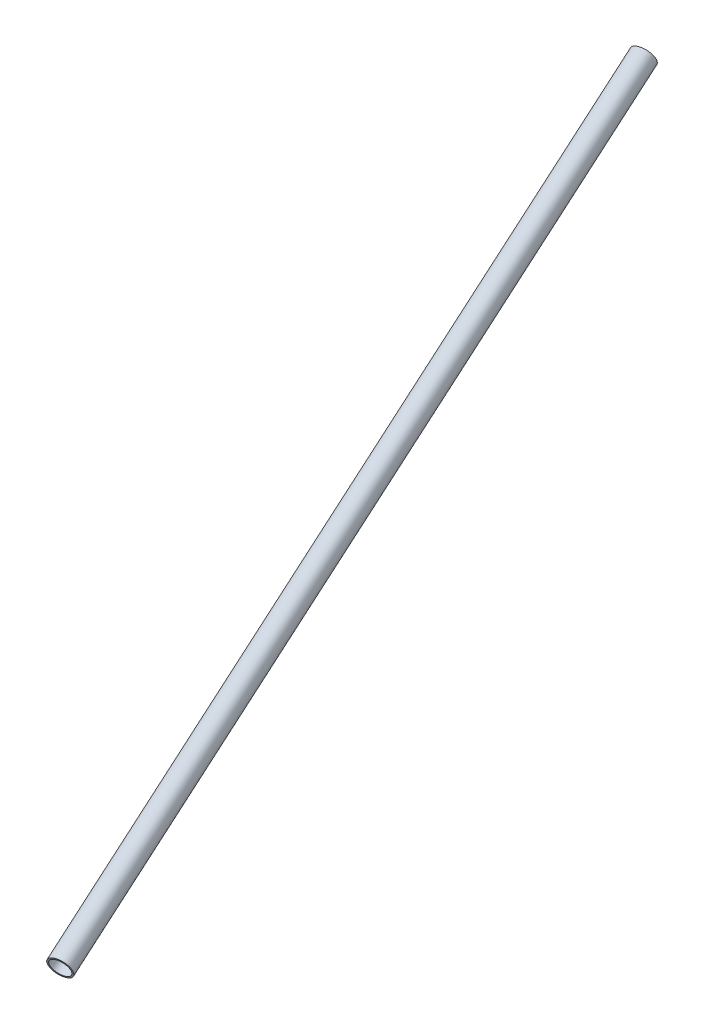
ISO-10303-21;
HEADER;
FILE_DESCRIPTION(('STEP AP214'),'2;1');
FILE_NAME('part.step','',(''),(''),'','','');
FILE_SCHEMA(('AUTOMOTIVE_DESIGN { 1 0 10303 214 1 1 1 1 }'));
ENDSEC;
DATA;
#1=APPLICATION_CONTEXT('core data for automotive mechanical design processes');
#2=APPLICATION_PROTOCOL_DEFINITION('international standard','automotive_design',2000,#1);
#3=PRODUCT_CONTEXT('',#1,'mechanical');
#4=PRODUCT('Part','Part','',(#3));
#5=PRODUCT_RELATED_PRODUCT_CATEGORY('part','',(#4));
#6=PRODUCT_DEFINITION_FORMATION('','',#4);
#7=PRODUCT_DEFINITION_CONTEXT('part definition',#1,'design');
#8=PRODUCT_DEFINITION('design','',#6,#7);
#9=PRODUCT_DEFINITION_SHAPE('','',#8);
#10=(LENGTH_UNIT() NAMED_UNIT(*) SI_UNIT(.MILLI.,.METRE.));
#11=(NAMED_UNIT(*) PLANE_ANGLE_UNIT() SI_UNIT($,.RADIAN.));
#12=(NAMED_UNIT(*) SI_UNIT($,.STERADIAN.) SOLID_ANGLE_UNIT());
#13=UNCERTAINTY_MEASURE_WITH_UNIT(LENGTH_MEASURE(1.E-05),#10,'distance_accuracy_value','');
#14=(GEOMETRIC_REPRESENTATION_CONTEXT(3) GLOBAL_UNCERTAINTY_ASSIGNED_CONTEXT((#13)) GLOBAL_UNIT_ASSIGNED_CONTEXT((#10,
#11,#12)) REPRESENTATION_CONTEXT('',''));
#15=CARTESIAN_POINT('',(0.,0.,0.));
#16=DIRECTION('',(0.,0.,1.));
#17=DIRECTION('',(1.,0.,0.));
#18=AXIS2_PLACEMENT_3D('',#15,#16,#17);
#19=CARTESIAN_POINT('',(-325.,320.,-1580.));
#20=DIRECTION('',(0.208710809439999,-0.381642622975999,0.900438063583998));
#21=DIRECTION('',(0.,-0.920714591276893,-0.390236647958419));
#22=AXIS2_PLACEMENT_3D('',#19,#20,#21);
#23=CYLINDRICAL_SURFACE('',#22,9.39999999999998);
#24=CARTESIAN_POINT('',(-325.,320.,-1580.));
#25=DIRECTION('',(-0.208710809439999,0.381642622975999,-0.900438063583998));
#26=DIRECTION('',(0.626062072534467,-0.655192350751652,-0.422811145608027));
#27=AXIS2_PLACEMENT_3D('',#24,#25,#26);
#28=CIRCLE('',#27,9.39999999999998);
#29=CARTESIAN_POINT('',(-319.115016518176,313.841191902934,-1583.97442476872));
#30=VERTEX_POINT('',#29);
#31=EDGE_CURVE('E46',#30,#30,#28,.T.);
#32=ORIENTED_EDGE('',*,*,#31,.T.);
#33=EDGE_LOOP('',(#32));
#34=FACE_BOUND('',#33,.T.);
#35=CARTESIAN_POINT('',(-150.,-4.44089209850063E-13,-825.));
#36=DIRECTION('',(-0.208710809439999,0.381642622975999,-0.900438063583998));
#37=DIRECTION('',(0.626062072534467,-0.655192350751652,-0.422811145608027));
#38=AXIS2_PLACEMENT_3D('',#35,#36,#37);
#39=CIRCLE('',#38,9.39999999999998);
#40=CARTESIAN_POINT('',(-144.115016518176,-6.15880809706596,-828.974424768715));
#41=VERTEX_POINT('',#40);
#42=EDGE_CURVE('E52',#41,#41,#39,.T.);
#43=ORIENTED_EDGE('',*,*,#42,.F.);
#44=EDGE_LOOP('',(#43));
#45=FACE_BOUND('',#44,.T.);
#46=ADVANCED_FACE('F39',(#34,#45),#23,.F.);
#47=CARTESIAN_POINT('',(-325.,320.,-1580.));
#48=DIRECTION('',(0.208710809439999,-0.381642622975999,0.900438063583998));
#49=DIRECTION('',(0.,-0.920714591276893,-0.390236647958419));
#50=AXIS2_PLACEMENT_3D('',#47,#48,#49);
#51=CYLINDRICAL_SURFACE('',#50,11.);
#52=CARTESIAN_POINT('',(-325.,320.,-1580.));
#53=DIRECTION('',(-0.208710809439999,0.381642622975999,-0.900438063583998));
#54=DIRECTION('',(0.626062072534467,-0.655192350751652,-0.422811145608027));
#55=AXIS2_PLACEMENT_3D('',#52,#53,#54);
#56=CIRCLE('',#55,11.);
#57=CARTESIAN_POINT('',(-318.113317202121,312.792884141731,-1584.65092260169));
#58=VERTEX_POINT('',#57);
#59=EDGE_CURVE('E10',#58,#58,#56,.T.);
#60=ORIENTED_EDGE('',*,*,#59,.F.);
#61=EDGE_LOOP('',(#60));
#62=FACE_BOUND('',#61,.T.);
#63=CARTESIAN_POINT('',(-150.,-4.44089209850063E-13,-825.));
#64=DIRECTION('',(-0.208710809439999,0.381642622975999,-0.900438063583998));
#65=DIRECTION('',(0.626062072534467,-0.655192350751652,-0.422811145608027));
#66=AXIS2_PLACEMENT_3D('',#63,#64,#65);
#67=CIRCLE('',#66,11.);
#68=CARTESIAN_POINT('',(-143.113317202121,-7.20711585826862,-829.650922601688));
#69=VERTEX_POINT('',#68);
#70=EDGE_CURVE('E42',#69,#69,#67,.T.);
#71=ORIENTED_EDGE('',*,*,#70,.T.);
#72=EDGE_LOOP('',(#71));
#73=FACE_BOUND('',#72,.T.);
#74=ADVANCED_FACE('F59',(#62,#73),#51,.T.);
#75=CARTESIAN_POINT('',(-325.,320.,-1580.));
#76=DIRECTION('',(-0.208710809439999,0.381642622975999,-0.900438063583998));
#77=DIRECTION('',(0.626062072534467,-0.655192350751652,-0.422811145608027));
#78=AXIS2_PLACEMENT_3D('',#75,#76,#77);
#79=PLANE('',#78);
#80=ORIENTED_EDGE('',*,*,#31,.F.);
#81=EDGE_LOOP('',(#80));
#82=FACE_BOUND('',#81,.T.);
#83=ORIENTED_EDGE('',*,*,#59,.T.);
#84=EDGE_LOOP('',(#83));
#85=FACE_BOUND('',#84,.T.);
#86=ADVANCED_FACE('F63',(#82,#85),#79,.T.);
#87=CARTESIAN_POINT('',(-150.,-4.44089209850063E-13,-825.));
#88=DIRECTION('',(-0.208710809439999,0.381642622975999,-0.900438063583998));
#89=DIRECTION('',(0.626062072534467,-0.655192350751652,-0.422811145608027));
#90=AXIS2_PLACEMENT_3D('',#87,#88,#89);
#91=PLANE('',#90);
#92=ORIENTED_EDGE('',*,*,#42,.T.);
#93=EDGE_LOOP('',(#92));
#94=FACE_BOUND('',#93,.T.);
#95=ORIENTED_EDGE('',*,*,#70,.F.);
#96=EDGE_LOOP('',(#95));
#97=FACE_BOUND('',#96,.T.);
#98=ADVANCED_FACE('F61',(#94,#97),#91,.F.);
#99=CLOSED_SHELL('',(#46,#74,#86,#98));
#100=MANIFOLD_SOLID_BREP('B2',#99);
#101=ADVANCED_BREP_SHAPE_REPRESENTATION('',(#18,#100),#14);
#102=SHAPE_DEFINITION_REPRESENTATION(#9,#101);
ENDSEC;
END-ISO-10303-21;
